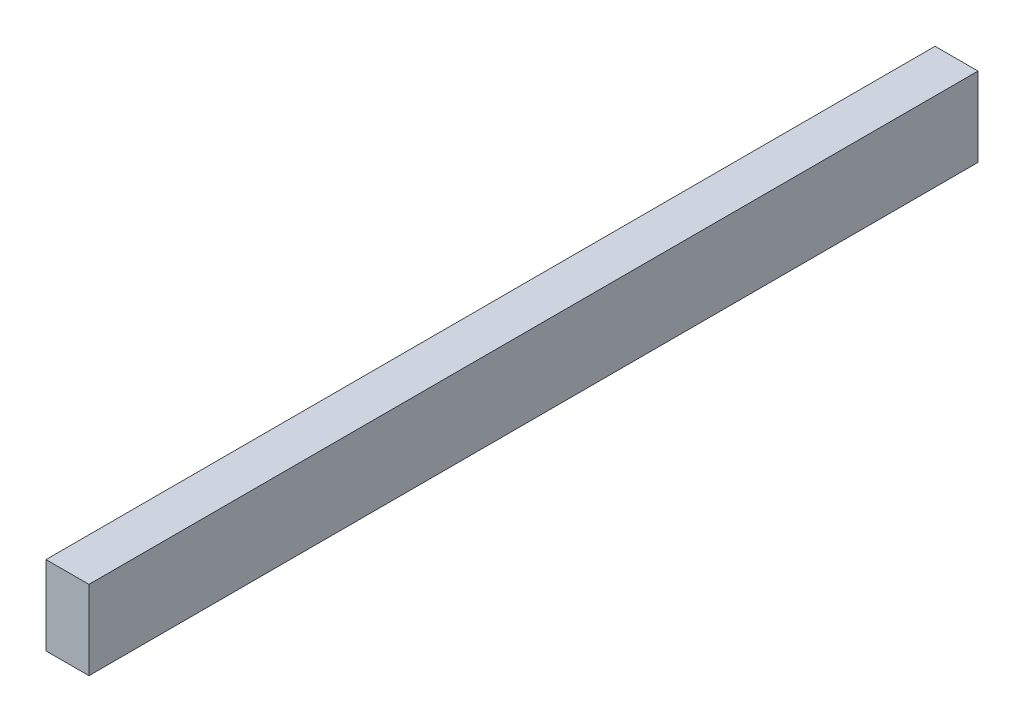
ISO-10303-21;
HEADER;
FILE_DESCRIPTION(('STEP AP214'),'2;1');
FILE_NAME('part.step','',(''),(''),'','','');
FILE_SCHEMA(('AUTOMOTIVE_DESIGN { 1 0 10303 214 1 1 1 1 }'));
ENDSEC;
DATA;
#1=APPLICATION_CONTEXT('core data for automotive mechanical design processes');
#2=APPLICATION_PROTOCOL_DEFINITION('international standard','automotive_design',2000,#1);
#3=PRODUCT_CONTEXT('',#1,'mechanical');
#4=PRODUCT('Part','Part','',(#3));
#5=PRODUCT_RELATED_PRODUCT_CATEGORY('part','',(#4));
#6=PRODUCT_DEFINITION_FORMATION('','',#4);
#7=PRODUCT_DEFINITION_CONTEXT('part definition',#1,'design');
#8=PRODUCT_DEFINITION('design','',#6,#7);
#9=PRODUCT_DEFINITION_SHAPE('','',#8);
#10=(LENGTH_UNIT() NAMED_UNIT(*) SI_UNIT(.MILLI.,.METRE.));
#11=(NAMED_UNIT(*) PLANE_ANGLE_UNIT() SI_UNIT($,.RADIAN.));
#12=(NAMED_UNIT(*) SI_UNIT($,.STERADIAN.) SOLID_ANGLE_UNIT());
#13=UNCERTAINTY_MEASURE_WITH_UNIT(LENGTH_MEASURE(1.E-05),#10,'distance_accuracy_value','');
#14=(GEOMETRIC_REPRESENTATION_CONTEXT(3) GLOBAL_UNCERTAINTY_ASSIGNED_CONTEXT((#13)) GLOBAL_UNIT_ASSIGNED_CONTEXT((#10,
#11,#12)) REPRESENTATION_CONTEXT('',''));
#15=CARTESIAN_POINT('',(0.,0.,0.));
#16=DIRECTION('',(0.,0.,1.));
#17=DIRECTION('',(1.,0.,0.));
#18=AXIS2_PLACEMENT_3D('',#15,#16,#17);
#19=CARTESIAN_POINT('',(3.5,6.45280161031886,23.7475677229017));
#20=DIRECTION('',(0.,0.,-1.));
#21=DIRECTION('',(-1.,0.,0.));
#22=AXIS2_PLACEMENT_3D('',#19,#20,#21);
#23=PLANE('',#22);
#24=DIRECTION('',(0.,-1.,0.));
#25=VECTOR('',#24,1.);
#26=CARTESIAN_POINT('',(0.,6.45280161031886,23.7475677229017));
#27=LINE('',#26,#25);
#28=CARTESIAN_POINT('',(0.,6.45280161031886,23.7475677229017));
#29=VERTEX_POINT('',#28);
#30=CARTESIAN_POINT('',(0.,0.,23.7475677229017));
#31=VERTEX_POINT('',#30);
#32=EDGE_CURVE('E98',#29,#31,#27,.T.);
#33=ORIENTED_EDGE('',*,*,#32,.T.);
#34=DIRECTION('',(-1.,0.,0.));
#35=VECTOR('',#34,1.);
#36=CARTESIAN_POINT('',(3.5,0.,23.7475677229017));
#37=LINE('',#36,#35);
#38=CARTESIAN_POINT('',(3.5,0.,23.7475677229017));
#39=VERTEX_POINT('',#38);
#40=EDGE_CURVE('E11',#39,#31,#37,.T.);
#41=ORIENTED_EDGE('',*,*,#40,.F.);
#42=DIRECTION('',(0.,-1.,0.));
#43=VECTOR('',#42,1.);
#44=CARTESIAN_POINT('',(3.5,6.45280161031886,23.7475677229017));
#45=LINE('',#44,#43);
#46=CARTESIAN_POINT('',(3.5,6.45280161031886,23.7475677229017));
#47=VERTEX_POINT('',#46);
#48=EDGE_CURVE('E86',#47,#39,#45,.T.);
#49=ORIENTED_EDGE('',*,*,#48,.F.);
#50=DIRECTION('',(-1.,0.,0.));
#51=VECTOR('',#50,1.);
#52=CARTESIAN_POINT('',(3.5,6.45280161031886,23.7475677229017));
#53=LINE('',#52,#51);
#54=EDGE_CURVE('E94',#47,#29,#53,.T.);
#55=ORIENTED_EDGE('',*,*,#54,.T.);
#56=EDGE_LOOP('',(#33,#41,#49,#55));
#57=FACE_BOUND('',#56,.T.);
#58=ADVANCED_FACE('F35',(#57),#23,.F.);
#59=CARTESIAN_POINT('',(3.5,0.,23.7475677229017));
#60=DIRECTION('',(0.,1.,0.));
#61=DIRECTION('',(0.,0.,1.));
#62=AXIS2_PLACEMENT_3D('',#59,#60,#61);
#63=PLANE('',#62);
#64=DIRECTION('',(0.,0.,-1.));
#65=VECTOR('',#64,1.);
#66=CARTESIAN_POINT('',(0.,0.,23.7475677229017));
#67=LINE('',#66,#65);
#68=CARTESIAN_POINT('',(0.,0.,-48.7524322770983));
#69=VERTEX_POINT('',#68);
#70=EDGE_CURVE('E90',#31,#69,#67,.T.);
#71=ORIENTED_EDGE('',*,*,#70,.T.);
#72=DIRECTION('',(-1.,0.,0.));
#73=VECTOR('',#72,1.);
#74=CARTESIAN_POINT('',(3.5,0.,-48.7524322770983));
#75=LINE('',#74,#73);
#76=CARTESIAN_POINT('',(3.5,0.,-48.7524322770983));
#77=VERTEX_POINT('',#76);
#78=EDGE_CURVE('E43',#77,#69,#75,.T.);
#79=ORIENTED_EDGE('',*,*,#78,.F.);
#80=DIRECTION('',(0.,0.,-1.));
#81=VECTOR('',#80,1.);
#82=CARTESIAN_POINT('',(3.5,0.,23.7475677229017));
#83=LINE('',#82,#81);
#84=EDGE_CURVE('E81',#39,#77,#83,.T.);
#85=ORIENTED_EDGE('',*,*,#84,.F.);
#86=ORIENTED_EDGE('',*,*,#40,.T.);
#87=EDGE_LOOP('',(#71,#79,#85,#86));
#88=FACE_BOUND('',#87,.T.);
#89=ADVANCED_FACE('F89',(#88),#63,.F.);
#90=CARTESIAN_POINT('',(3.5,0.,-48.7524322770983));
#91=DIRECTION('',(0.,0.,1.));
#92=DIRECTION('',(1.,0.,0.));
#93=AXIS2_PLACEMENT_3D('',#90,#91,#92);
#94=PLANE('',#93);
#95=DIRECTION('',(0.,1.,0.));
#96=VECTOR('',#95,1.);
#97=CARTESIAN_POINT('',(0.,0.,-48.7524322770983));
#98=LINE('',#97,#96);
#99=CARTESIAN_POINT('',(0.,6.45280161031886,-48.7524322770983));
#100=VERTEX_POINT('',#99);
#101=EDGE_CURVE('E68',#69,#100,#98,.T.);
#102=ORIENTED_EDGE('',*,*,#101,.T.);
#103=DIRECTION('',(-1.,0.,0.));
#104=VECTOR('',#103,1.);
#105=CARTESIAN_POINT('',(3.5,6.45280161031886,-48.7524322770983));
#106=LINE('',#105,#104);
#107=CARTESIAN_POINT('',(3.5,6.45280161031886,-48.7524322770983));
#108=VERTEX_POINT('',#107);
#109=EDGE_CURVE('E91',#108,#100,#106,.T.);
#110=ORIENTED_EDGE('',*,*,#109,.F.);
#111=DIRECTION('',(0.,1.,0.));
#112=VECTOR('',#111,1.);
#113=CARTESIAN_POINT('',(3.5,0.,-48.7524322770983));
#114=LINE('',#113,#112);
#115=EDGE_CURVE('E84',#77,#108,#114,.T.);
#116=ORIENTED_EDGE('',*,*,#115,.F.);
#117=ORIENTED_EDGE('',*,*,#78,.T.);
#118=EDGE_LOOP('',(#102,#110,#116,#117));
#119=FACE_BOUND('',#118,.T.);
#120=ADVANCED_FACE('F92',(#119),#94,.F.);
#121=CARTESIAN_POINT('',(3.5,6.45280161031886,-48.7524322770983));
#122=DIRECTION('',(0.,-1.,0.));
#123=DIRECTION('',(0.,0.,-1.));
#124=AXIS2_PLACEMENT_3D('',#121,#122,#123);
#125=PLANE('',#124);
#126=DIRECTION('',(0.,0.,1.));
#127=VECTOR('',#126,1.);
#128=CARTESIAN_POINT('',(0.,6.45280161031886,-48.7524322770983));
#129=LINE('',#128,#127);
#130=EDGE_CURVE('E74',#100,#29,#129,.T.);
#131=ORIENTED_EDGE('',*,*,#130,.T.);
#132=ORIENTED_EDGE('',*,*,#54,.F.);
#133=DIRECTION('',(0.,0.,1.));
#134=VECTOR('',#133,1.);
#135=CARTESIAN_POINT('',(3.5,6.45280161031886,-48.7524322770983));
#136=LINE('',#135,#134);
#137=EDGE_CURVE('E51',#108,#47,#136,.T.);
#138=ORIENTED_EDGE('',*,*,#137,.F.);
#139=ORIENTED_EDGE('',*,*,#109,.T.);
#140=EDGE_LOOP('',(#131,#132,#138,#139));
#141=FACE_BOUND('',#140,.T.);
#142=ADVANCED_FACE('F105',(#141),#125,.F.);
#143=CARTESIAN_POINT('',(3.5,0.,0.));
#144=DIRECTION('',(1.,0.,0.));
#145=DIRECTION('',(0.,0.,-1.));
#146=AXIS2_PLACEMENT_3D('',#143,#144,#145);
#147=PLANE('',#146);
#148=ORIENTED_EDGE('',*,*,#48,.T.);
#149=ORIENTED_EDGE('',*,*,#84,.T.);
#150=ORIENTED_EDGE('',*,*,#115,.T.);
#151=ORIENTED_EDGE('',*,*,#137,.T.);
#152=EDGE_LOOP('',(#148,#149,#150,#151));
#153=FACE_BOUND('',#152,.T.);
#154=ADVANCED_FACE('F82',(#153),#147,.T.);
#155=CARTESIAN_POINT('',(0.,0.,0.));
#156=DIRECTION('',(1.,0.,0.));
#157=DIRECTION('',(0.,0.,-1.));
#158=AXIS2_PLACEMENT_3D('',#155,#156,#157);
#159=PLANE('',#158);
#160=ORIENTED_EDGE('',*,*,#32,.F.);
#161=ORIENTED_EDGE('',*,*,#130,.F.);
#162=ORIENTED_EDGE('',*,*,#101,.F.);
#163=ORIENTED_EDGE('',*,*,#70,.F.);
#164=EDGE_LOOP('',(#160,#161,#162,#163));
#165=FACE_BOUND('',#164,.T.);
#166=ADVANCED_FACE('F108',(#165),#159,.F.);
#167=CLOSED_SHELL('',(#58,#89,#120,#142,#154,#166));
#168=MANIFOLD_SOLID_BREP('B2',#167);
#169=ADVANCED_BREP_SHAPE_REPRESENTATION('',(#18,#168),#14);
#170=SHAPE_DEFINITION_REPRESENTATION(#9,#169);
ENDSEC;
END-ISO-10303-21;
